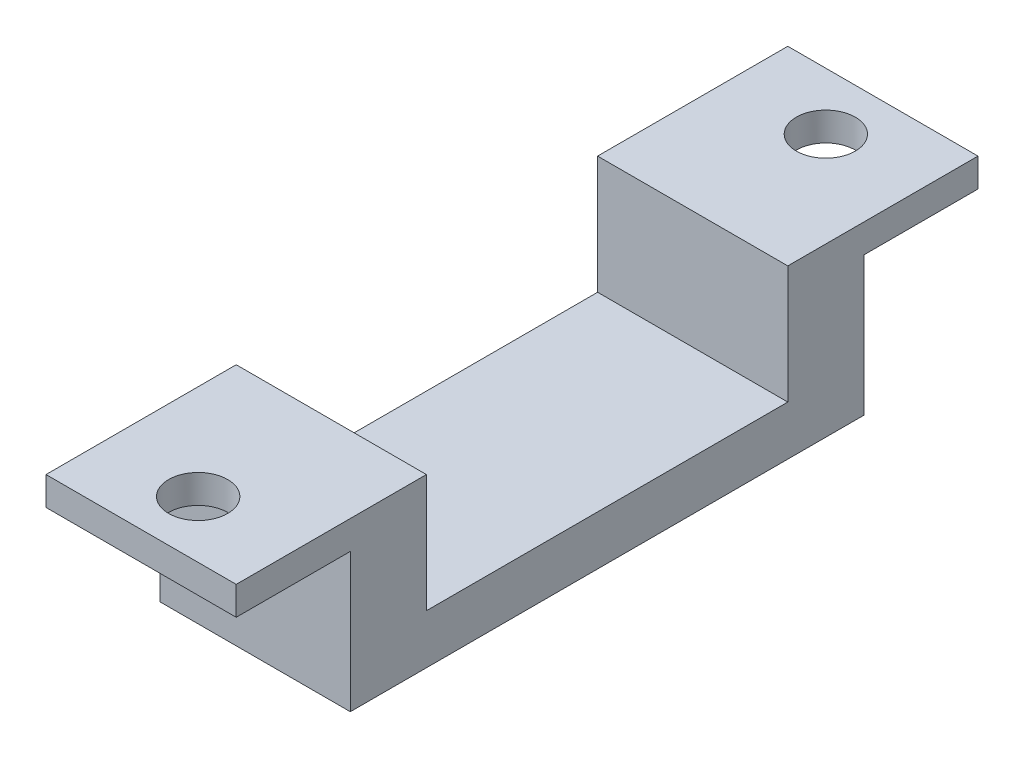
ISO-10303-21;
HEADER;
FILE_DESCRIPTION(('STEP AP214'),'2;1');
FILE_NAME('part.step','',(''),(''),'','','');
FILE_SCHEMA(('AUTOMOTIVE_DESIGN { 1 0 10303 214 1 1 1 1 }'));
ENDSEC;
DATA;
#1=APPLICATION_CONTEXT('core data for automotive mechanical design processes');
#2=APPLICATION_PROTOCOL_DEFINITION('international standard','automotive_design',2000,#1);
#3=PRODUCT_CONTEXT('',#1,'mechanical');
#4=PRODUCT('Part','Part','',(#3));
#5=PRODUCT_RELATED_PRODUCT_CATEGORY('part','',(#4));
#6=PRODUCT_DEFINITION_FORMATION('','',#4);
#7=PRODUCT_DEFINITION_CONTEXT('part definition',#1,'design');
#8=PRODUCT_DEFINITION('design','',#6,#7);
#9=PRODUCT_DEFINITION_SHAPE('','',#8);
#10=(LENGTH_UNIT() NAMED_UNIT(*) SI_UNIT(.MILLI.,.METRE.));
#11=(NAMED_UNIT(*) PLANE_ANGLE_UNIT() SI_UNIT($,.RADIAN.));
#12=(NAMED_UNIT(*) SI_UNIT($,.STERADIAN.) SOLID_ANGLE_UNIT());
#13=UNCERTAINTY_MEASURE_WITH_UNIT(LENGTH_MEASURE(1.E-05),#10,'distance_accuracy_value','');
#14=(GEOMETRIC_REPRESENTATION_CONTEXT(3) GLOBAL_UNCERTAINTY_ASSIGNED_CONTEXT((#13)) GLOBAL_UNIT_ASSIGNED_CONTEXT((#10,
#11,#12)) REPRESENTATION_CONTEXT('',''));
#15=CARTESIAN_POINT('',(0.,0.,0.));
#16=DIRECTION('',(0.,0.,1.));
#17=DIRECTION('',(1.,0.,0.));
#18=AXIS2_PLACEMENT_3D('',#15,#16,#17);
#19=CARTESIAN_POINT('',(-5.,2.6,-13.5));
#20=DIRECTION('',(0.,0.,1.));
#21=DIRECTION('',(1.,0.,0.));
#22=AXIS2_PLACEMENT_3D('',#19,#20,#21);
#23=PLANE('',#22);
#24=DIRECTION('',(-1.,0.,0.));
#25=VECTOR('',#24,1.);
#26=CARTESIAN_POINT('',(-5.,0.,-13.5));
#27=LINE('',#26,#25);
#28=CARTESIAN_POINT('',(5.,0.,-13.5));
#29=VERTEX_POINT('',#28);
#30=CARTESIAN_POINT('',(-5.,0.,-13.5));
#31=VERTEX_POINT('',#30);
#32=EDGE_CURVE('E220',#29,#31,#27,.T.);
#33=ORIENTED_EDGE('',*,*,#32,.T.);
#34=DIRECTION('',(0.,-1.,0.));
#35=VECTOR('',#34,1.);
#36=CARTESIAN_POINT('',(-5.,2.6,-13.5));
#37=LINE('',#36,#35);
#38=CARTESIAN_POINT('',(-5.,7.3,-13.5));
#39=VERTEX_POINT('',#38);
#40=EDGE_CURVE('E46',#39,#31,#37,.T.);
#41=ORIENTED_EDGE('',*,*,#40,.F.);
#42=DIRECTION('',(-1.,0.,0.));
#43=VECTOR('',#42,1.);
#44=CARTESIAN_POINT('',(5.,7.3,-13.5));
#45=LINE('',#44,#43);
#46=CARTESIAN_POINT('',(5.,7.3,-13.5));
#47=VERTEX_POINT('',#46);
#48=EDGE_CURVE('E177',#47,#39,#45,.T.);
#49=ORIENTED_EDGE('',*,*,#48,.F.);
#50=DIRECTION('',(0.,-1.,0.));
#51=VECTOR('',#50,1.);
#52=CARTESIAN_POINT('',(5.,2.6,-13.5));
#53=LINE('',#52,#51);
#54=EDGE_CURVE('E11',#47,#29,#53,.T.);
#55=ORIENTED_EDGE('',*,*,#54,.T.);
#56=EDGE_LOOP('',(#33,#41,#49,#55));
#57=FACE_BOUND('',#56,.T.);
#58=ADVANCED_FACE('F38',(#57),#23,.F.);
#59=CARTESIAN_POINT('',(0.,2.6,0.));
#60=DIRECTION('',(0.,-1.,0.));
#61=DIRECTION('',(0.,0.,-1.));
#62=AXIS2_PLACEMENT_3D('',#59,#60,#61);
#63=PLANE('',#62);
#64=DIRECTION('',(0.,0.,1.));
#65=VECTOR('',#64,1.);
#66=CARTESIAN_POINT('',(-5.,2.6,13.5));
#67=LINE('',#66,#65);
#68=CARTESIAN_POINT('',(-5.,2.6,-9.5));
#69=VERTEX_POINT('',#68);
#70=CARTESIAN_POINT('',(-5.,2.6,9.5));
#71=VERTEX_POINT('',#70);
#72=EDGE_CURVE('E214',#69,#71,#67,.T.);
#73=ORIENTED_EDGE('',*,*,#72,.T.);
#74=DIRECTION('',(1.,0.,0.));
#75=VECTOR('',#74,1.);
#76=CARTESIAN_POINT('',(-5.,2.6,9.5));
#77=LINE('',#76,#75);
#78=CARTESIAN_POINT('',(5.,2.6,9.5));
#79=VERTEX_POINT('',#78);
#80=EDGE_CURVE('E61',#71,#79,#77,.T.);
#81=ORIENTED_EDGE('',*,*,#80,.T.);
#82=DIRECTION('',(0.,0.,-1.));
#83=VECTOR('',#82,1.);
#84=CARTESIAN_POINT('',(5.,2.6,13.5));
#85=LINE('',#84,#83);
#86=CARTESIAN_POINT('',(5.,2.6,-9.5));
#87=VERTEX_POINT('',#86);
#88=EDGE_CURVE('E212',#79,#87,#85,.T.);
#89=ORIENTED_EDGE('',*,*,#88,.T.);
#90=DIRECTION('',(1.,0.,0.));
#91=VECTOR('',#90,1.);
#92=CARTESIAN_POINT('',(-5.,2.6,-9.5));
#93=LINE('',#92,#91);
#94=EDGE_CURVE('E196',#69,#87,#93,.T.);
#95=ORIENTED_EDGE('',*,*,#94,.F.);
#96=EDGE_LOOP('',(#73,#81,#89,#95));
#97=FACE_BOUND('',#96,.T.);
#98=ADVANCED_FACE('F251',(#97),#63,.F.);
#99=CARTESIAN_POINT('',(5.,2.6,13.5));
#100=DIRECTION('',(-1.,0.,0.));
#101=DIRECTION('',(0.,0.,1.));
#102=AXIS2_PLACEMENT_3D('',#99,#100,#101);
#103=PLANE('',#102);
#104=DIRECTION('',(0.,0.,-1.));
#105=VECTOR('',#104,1.);
#106=CARTESIAN_POINT('',(5.,0.,13.5));
#107=LINE('',#106,#105);
#108=CARTESIAN_POINT('',(5.,0.,13.5));
#109=VERTEX_POINT('',#108);
#110=EDGE_CURVE('E211',#109,#29,#107,.T.);
#111=ORIENTED_EDGE('',*,*,#110,.T.);
#112=ORIENTED_EDGE('',*,*,#54,.F.);
#113=DIRECTION('',(0.,0.,1.));
#114=VECTOR('',#113,1.);
#115=CARTESIAN_POINT('',(5.,7.3,-19.5));
#116=LINE('',#115,#114);
#117=CARTESIAN_POINT('',(5.,7.3,-19.5));
#118=VERTEX_POINT('',#117);
#119=EDGE_CURVE('E193',#118,#47,#116,.T.);
#120=ORIENTED_EDGE('',*,*,#119,.F.);
#121=DIRECTION('',(0.,-1.,0.));
#122=VECTOR('',#121,1.);
#123=CARTESIAN_POINT('',(5.,7.3,-19.5));
#124=LINE('',#123,#122);
#125=CARTESIAN_POINT('',(5.,8.8,-19.5));
#126=VERTEX_POINT('',#125);
#127=EDGE_CURVE('E184',#126,#118,#124,.T.);
#128=ORIENTED_EDGE('',*,*,#127,.F.);
#129=DIRECTION('',(0.,0.,-1.));
#130=VECTOR('',#129,1.);
#131=CARTESIAN_POINT('',(5.,8.8,-9.5));
#132=LINE('',#131,#130);
#133=CARTESIAN_POINT('',(5.,8.8,-9.5));
#134=VERTEX_POINT('',#133);
#135=EDGE_CURVE('E197',#134,#126,#132,.T.);
#136=ORIENTED_EDGE('',*,*,#135,.F.);
#137=DIRECTION('',(0.,-1.,0.));
#138=VECTOR('',#137,1.);
#139=CARTESIAN_POINT('',(5.,8.8,-9.5));
#140=LINE('',#139,#138);
#141=EDGE_CURVE('E203',#134,#87,#140,.T.);
#142=ORIENTED_EDGE('',*,*,#141,.T.);
#143=ORIENTED_EDGE('',*,*,#88,.F.);
#144=DIRECTION('',(0.,-1.,0.));
#145=VECTOR('',#144,1.);
#146=CARTESIAN_POINT('',(5.,8.8,9.5));
#147=LINE('',#146,#145);
#148=CARTESIAN_POINT('',(5.,8.8,9.5));
#149=VERTEX_POINT('',#148);
#150=EDGE_CURVE('E168',#149,#79,#147,.T.);
#151=ORIENTED_EDGE('',*,*,#150,.F.);
#152=DIRECTION('',(0.,0.,1.));
#153=VECTOR('',#152,1.);
#154=CARTESIAN_POINT('',(5.,8.8,9.5));
#155=LINE('',#154,#153);
#156=CARTESIAN_POINT('',(5.,8.8,19.5));
#157=VERTEX_POINT('',#156);
#158=EDGE_CURVE('E157',#149,#157,#155,.T.);
#159=ORIENTED_EDGE('',*,*,#158,.T.);
#160=DIRECTION('',(0.,-1.,0.));
#161=VECTOR('',#160,1.);
#162=CARTESIAN_POINT('',(5.,7.3,19.5));
#163=LINE('',#162,#161);
#164=CARTESIAN_POINT('',(5.,7.3,19.5));
#165=VERTEX_POINT('',#164);
#166=EDGE_CURVE('E148',#157,#165,#163,.T.);
#167=ORIENTED_EDGE('',*,*,#166,.T.);
#168=DIRECTION('',(0.,0.,-1.));
#169=VECTOR('',#168,1.);
#170=CARTESIAN_POINT('',(5.,7.3,19.5));
#171=LINE('',#170,#169);
#172=CARTESIAN_POINT('',(5.,7.3,13.5));
#173=VERTEX_POINT('',#172);
#174=EDGE_CURVE('E135',#165,#173,#171,.T.);
#175=ORIENTED_EDGE('',*,*,#174,.T.);
#176=DIRECTION('',(0.,-1.,0.));
#177=VECTOR('',#176,1.);
#178=CARTESIAN_POINT('',(5.,2.6,13.5));
#179=LINE('',#178,#177);
#180=EDGE_CURVE('E217',#173,#109,#179,.T.);
#181=ORIENTED_EDGE('',*,*,#180,.T.);
#182=EDGE_LOOP('',(#111,#112,#120,#128,#136,#142,#143,#151,#159,#167,#175,#181));
#183=FACE_BOUND('',#182,.T.);
#184=ADVANCED_FACE('F40',(#183),#103,.F.);
#185=CARTESIAN_POINT('',(-5.,2.6,13.5));
#186=DIRECTION('',(1.,0.,0.));
#187=DIRECTION('',(0.,0.,-1.));
#188=AXIS2_PLACEMENT_3D('',#185,#186,#187);
#189=PLANE('',#188);
#190=ORIENTED_EDGE('',*,*,#72,.F.);
#191=DIRECTION('',(0.,-1.,0.));
#192=VECTOR('',#191,1.);
#193=CARTESIAN_POINT('',(-5.,8.8,-9.5));
#194=LINE('',#193,#192);
#195=CARTESIAN_POINT('',(-5.,8.8,-9.5));
#196=VERTEX_POINT('',#195);
#197=EDGE_CURVE('E208',#196,#69,#194,.T.);
#198=ORIENTED_EDGE('',*,*,#197,.F.);
#199=DIRECTION('',(0.,0.,1.));
#200=VECTOR('',#199,1.);
#201=CARTESIAN_POINT('',(-5.,8.8,-9.5));
#202=LINE('',#201,#200);
#203=CARTESIAN_POINT('',(-5.,8.8,-19.5));
#204=VERTEX_POINT('',#203);
#205=EDGE_CURVE('E199',#204,#196,#202,.T.);
#206=ORIENTED_EDGE('',*,*,#205,.F.);
#207=DIRECTION('',(0.,1.,0.));
#208=VECTOR('',#207,1.);
#209=CARTESIAN_POINT('',(-5.,7.3,-19.5));
#210=LINE('',#209,#208);
#211=CARTESIAN_POINT('',(-5.,7.3,-19.5));
#212=VERTEX_POINT('',#211);
#213=EDGE_CURVE('E178',#212,#204,#210,.T.);
#214=ORIENTED_EDGE('',*,*,#213,.F.);
#215=DIRECTION('',(0.,0.,1.));
#216=VECTOR('',#215,1.);
#217=CARTESIAN_POINT('',(-5.,7.3,-19.5));
#218=LINE('',#217,#216);
#219=EDGE_CURVE('E188',#212,#39,#218,.T.);
#220=ORIENTED_EDGE('',*,*,#219,.T.);
#221=ORIENTED_EDGE('',*,*,#40,.T.);
#222=DIRECTION('',(0.,0.,1.));
#223=VECTOR('',#222,1.);
#224=CARTESIAN_POINT('',(-5.,0.,13.5));
#225=LINE('',#224,#223);
#226=CARTESIAN_POINT('',(-5.,0.,13.5));
#227=VERTEX_POINT('',#226);
#228=EDGE_CURVE('E223',#31,#227,#225,.T.);
#229=ORIENTED_EDGE('',*,*,#228,.T.);
#230=DIRECTION('',(0.,-1.,0.));
#231=VECTOR('',#230,1.);
#232=CARTESIAN_POINT('',(-5.,2.6,13.5));
#233=LINE('',#232,#231);
#234=CARTESIAN_POINT('',(-5.,7.3,13.5));
#235=VERTEX_POINT('',#234);
#236=EDGE_CURVE('E134',#235,#227,#233,.T.);
#237=ORIENTED_EDGE('',*,*,#236,.F.);
#238=DIRECTION('',(0.,0.,-1.));
#239=VECTOR('',#238,1.);
#240=CARTESIAN_POINT('',(-5.,7.3,19.5));
#241=LINE('',#240,#239);
#242=CARTESIAN_POINT('',(-5.,7.3,19.5));
#243=VERTEX_POINT('',#242);
#244=EDGE_CURVE('E53',#243,#235,#241,.T.);
#245=ORIENTED_EDGE('',*,*,#244,.F.);
#246=DIRECTION('',(0.,1.,0.));
#247=VECTOR('',#246,1.);
#248=CARTESIAN_POINT('',(-5.,7.3,19.5));
#249=LINE('',#248,#247);
#250=CARTESIAN_POINT('',(-5.,8.8,19.5));
#251=VERTEX_POINT('',#250);
#252=EDGE_CURVE('E131',#243,#251,#249,.T.);
#253=ORIENTED_EDGE('',*,*,#252,.T.);
#254=DIRECTION('',(0.,0.,-1.));
#255=VECTOR('',#254,1.);
#256=CARTESIAN_POINT('',(-5.,8.8,9.5));
#257=LINE('',#256,#255);
#258=CARTESIAN_POINT('',(-5.,8.8,9.5));
#259=VERTEX_POINT('',#258);
#260=EDGE_CURVE('E162',#251,#259,#257,.T.);
#261=ORIENTED_EDGE('',*,*,#260,.T.);
#262=DIRECTION('',(0.,-1.,0.));
#263=VECTOR('',#262,1.);
#264=CARTESIAN_POINT('',(-5.,8.8,9.5));
#265=LINE('',#264,#263);
#266=EDGE_CURVE('E164',#259,#71,#265,.T.);
#267=ORIENTED_EDGE('',*,*,#266,.T.);
#268=EDGE_LOOP('',(#190,#198,#206,#214,#220,#221,#229,#237,#245,#253,#261,#267));
#269=FACE_BOUND('',#268,.T.);
#270=ADVANCED_FACE('F129',(#269),#189,.F.);
#271=CARTESIAN_POINT('',(-5.,2.6,13.5));
#272=DIRECTION('',(0.,0.,-1.));
#273=DIRECTION('',(-1.,0.,0.));
#274=AXIS2_PLACEMENT_3D('',#271,#272,#273);
#275=PLANE('',#274);
#276=ORIENTED_EDGE('',*,*,#180,.F.);
#277=DIRECTION('',(-1.,0.,0.));
#278=VECTOR('',#277,1.);
#279=CARTESIAN_POINT('',(5.,7.3,13.5));
#280=LINE('',#279,#278);
#281=EDGE_CURVE('E145',#173,#235,#280,.T.);
#282=ORIENTED_EDGE('',*,*,#281,.T.);
#283=ORIENTED_EDGE('',*,*,#236,.T.);
#284=DIRECTION('',(1.,0.,0.));
#285=VECTOR('',#284,1.);
#286=CARTESIAN_POINT('',(-5.,0.,13.5));
#287=LINE('',#286,#285);
#288=EDGE_CURVE('E215',#227,#109,#287,.T.);
#289=ORIENTED_EDGE('',*,*,#288,.T.);
#290=EDGE_LOOP('',(#276,#282,#283,#289));
#291=FACE_BOUND('',#290,.T.);
#292=ADVANCED_FACE('F240',(#291),#275,.F.);
#293=CARTESIAN_POINT('',(0.,0.,0.));
#294=DIRECTION('',(0.,-1.,0.));
#295=DIRECTION('',(0.,0.,-1.));
#296=AXIS2_PLACEMENT_3D('',#293,#294,#295);
#297=PLANE('',#296);
#298=ORIENTED_EDGE('',*,*,#110,.F.);
#299=ORIENTED_EDGE('',*,*,#288,.F.);
#300=ORIENTED_EDGE('',*,*,#228,.F.);
#301=ORIENTED_EDGE('',*,*,#32,.F.);
#302=EDGE_LOOP('',(#298,#299,#300,#301));
#303=FACE_BOUND('',#302,.T.);
#304=ADVANCED_FACE('F237',(#303),#297,.T.);
#305=CARTESIAN_POINT('',(-5.,8.8,-9.5));
#306=DIRECTION('',(0.,0.,-1.));
#307=DIRECTION('',(-1.,0.,0.));
#308=AXIS2_PLACEMENT_3D('',#305,#306,#307);
#309=PLANE('',#308);
#310=ORIENTED_EDGE('',*,*,#94,.T.);
#311=ORIENTED_EDGE('',*,*,#141,.F.);
#312=DIRECTION('',(1.,0.,0.));
#313=VECTOR('',#312,1.);
#314=CARTESIAN_POINT('',(-5.,8.8,-9.5));
#315=LINE('',#314,#313);
#316=EDGE_CURVE('E201',#196,#134,#315,.T.);
#317=ORIENTED_EDGE('',*,*,#316,.F.);
#318=ORIENTED_EDGE('',*,*,#197,.T.);
#319=EDGE_LOOP('',(#310,#311,#317,#318));
#320=FACE_BOUND('',#319,.T.);
#321=ADVANCED_FACE('F253',(#320),#309,.F.);
#322=CARTESIAN_POINT('',(0.,8.8,0.));
#323=DIRECTION('',(0.,-1.,0.));
#324=DIRECTION('',(0.,0.,-1.));
#325=AXIS2_PLACEMENT_3D('',#322,#323,#324);
#326=PLANE('',#325);
#327=CARTESIAN_POINT('',(0.,8.8,-16.5));
#328=DIRECTION('',(0.,-1.,0.));
#329=DIRECTION('',(0.,0.,-1.));
#330=AXIS2_PLACEMENT_3D('',#327,#328,#329);
#331=CIRCLE('',#330,1.55);
#332=CARTESIAN_POINT('',(0.,8.8,-18.05));
#333=VERTEX_POINT('',#332);
#334=EDGE_CURVE('E174',#333,#333,#331,.T.);
#335=ORIENTED_EDGE('',*,*,#334,.T.);
#336=EDGE_LOOP('',(#335));
#337=FACE_BOUND('',#336,.T.);
#338=ORIENTED_EDGE('',*,*,#135,.T.);
#339=DIRECTION('',(1.,0.,0.));
#340=VECTOR('',#339,1.);
#341=CARTESIAN_POINT('',(5.,8.8,-19.5));
#342=LINE('',#341,#340);
#343=EDGE_CURVE('E181',#204,#126,#342,.T.);
#344=ORIENTED_EDGE('',*,*,#343,.F.);
#345=ORIENTED_EDGE('',*,*,#205,.T.);
#346=ORIENTED_EDGE('',*,*,#316,.T.);
#347=EDGE_LOOP('',(#338,#344,#345,#346));
#348=FACE_BOUND('',#347,.T.);
#349=ADVANCED_FACE('F257',(#337,#348),#326,.F.);
#350=CARTESIAN_POINT('',(5.,7.3,-19.5));
#351=DIRECTION('',(0.,1.,0.));
#352=DIRECTION('',(0.,0.,1.));
#353=AXIS2_PLACEMENT_3D('',#350,#351,#352);
#354=PLANE('',#353);
#355=CARTESIAN_POINT('',(0.,7.3,-16.5));
#356=DIRECTION('',(0.,-1.,0.));
#357=DIRECTION('',(1.,0.,0.));
#358=AXIS2_PLACEMENT_3D('',#355,#356,#357);
#359=CIRCLE('',#358,1.55);
#360=CARTESIAN_POINT('',(1.55,7.3,-16.5));
#361=VERTEX_POINT('',#360);
#362=EDGE_CURVE('E171',#361,#361,#359,.T.);
#363=ORIENTED_EDGE('',*,*,#362,.F.);
#364=EDGE_LOOP('',(#363));
#365=FACE_BOUND('',#364,.T.);
#366=ORIENTED_EDGE('',*,*,#48,.T.);
#367=ORIENTED_EDGE('',*,*,#219,.F.);
#368=DIRECTION('',(-1.,0.,0.));
#369=VECTOR('',#368,1.);
#370=CARTESIAN_POINT('',(5.,7.3,-19.5));
#371=LINE('',#370,#369);
#372=EDGE_CURVE('E186',#118,#212,#371,.T.);
#373=ORIENTED_EDGE('',*,*,#372,.F.);
#374=ORIENTED_EDGE('',*,*,#119,.T.);
#375=EDGE_LOOP('',(#366,#367,#373,#374));
#376=FACE_BOUND('',#375,.T.);
#377=ADVANCED_FACE('F264',(#365,#376),#354,.F.);
#378=CARTESIAN_POINT('',(0.,0.,-19.5));
#379=DIRECTION('',(0.,0.,1.));
#380=DIRECTION('',(1.,0.,0.));
#381=AXIS2_PLACEMENT_3D('',#378,#379,#380);
#382=PLANE('',#381);
#383=ORIENTED_EDGE('',*,*,#213,.T.);
#384=ORIENTED_EDGE('',*,*,#343,.T.);
#385=ORIENTED_EDGE('',*,*,#127,.T.);
#386=ORIENTED_EDGE('',*,*,#372,.T.);
#387=EDGE_LOOP('',(#383,#384,#385,#386));
#388=FACE_BOUND('',#387,.T.);
#389=ADVANCED_FACE('F260',(#388),#382,.F.);
#390=CARTESIAN_POINT('',(0.,12.3,-16.5));
#391=DIRECTION('',(0.,-1.,0.));
#392=DIRECTION('',(1.,0.,0.));
#393=AXIS2_PLACEMENT_3D('',#390,#391,#392);
#394=CYLINDRICAL_SURFACE('',#393,1.55);
#395=ORIENTED_EDGE('',*,*,#362,.T.);
#396=EDGE_LOOP('',(#395));
#397=FACE_BOUND('',#396,.T.);
#398=ORIENTED_EDGE('',*,*,#334,.F.);
#399=EDGE_LOOP('',(#398));
#400=FACE_BOUND('',#399,.T.);
#401=ADVANCED_FACE('F272',(#397,#400),#394,.F.);
#402=CARTESIAN_POINT('',(-5.,8.8,9.5));
#403=DIRECTION('',(0.,0.,-1.));
#404=DIRECTION('',(-1.,0.,0.));
#405=AXIS2_PLACEMENT_3D('',#402,#403,#404);
#406=PLANE('',#405);
#407=ORIENTED_EDGE('',*,*,#80,.F.);
#408=ORIENTED_EDGE('',*,*,#266,.F.);
#409=DIRECTION('',(1.,0.,0.));
#410=VECTOR('',#409,1.);
#411=CARTESIAN_POINT('',(-5.,8.8,9.5));
#412=LINE('',#411,#410);
#413=EDGE_CURVE('E159',#259,#149,#412,.T.);
#414=ORIENTED_EDGE('',*,*,#413,.T.);
#415=ORIENTED_EDGE('',*,*,#150,.T.);
#416=EDGE_LOOP('',(#407,#408,#414,#415));
#417=FACE_BOUND('',#416,.T.);
#418=ADVANCED_FACE('F248',(#417),#406,.T.);
#419=CARTESIAN_POINT('',(0.,8.8,0.));
#420=DIRECTION('',(0.,-1.,0.));
#421=DIRECTION('',(0.,0.,1.));
#422=AXIS2_PLACEMENT_3D('',#419,#420,#421);
#423=PLANE('',#422);
#424=CARTESIAN_POINT('',(0.,8.8,16.5));
#425=DIRECTION('',(0.,-1.,0.));
#426=DIRECTION('',(0.,0.,-1.));
#427=AXIS2_PLACEMENT_3D('',#424,#425,#426);
#428=CIRCLE('',#427,1.55);
#429=CARTESIAN_POINT('',(0.,8.8,14.95));
#430=VERTEX_POINT('',#429);
#431=EDGE_CURVE('E155',#430,#430,#428,.F.);
#432=ORIENTED_EDGE('',*,*,#431,.F.);
#433=EDGE_LOOP('',(#432));
#434=FACE_BOUND('',#433,.T.);
#435=ORIENTED_EDGE('',*,*,#158,.F.);
#436=ORIENTED_EDGE('',*,*,#413,.F.);
#437=ORIENTED_EDGE('',*,*,#260,.F.);
#438=DIRECTION('',(1.,0.,0.));
#439=VECTOR('',#438,1.);
#440=CARTESIAN_POINT('',(5.,8.8,19.5));
#441=LINE('',#440,#439);
#442=EDGE_CURVE('E144',#251,#157,#441,.T.);
#443=ORIENTED_EDGE('',*,*,#442,.T.);
#444=EDGE_LOOP('',(#435,#436,#437,#443));
#445=FACE_BOUND('',#444,.T.);
#446=ADVANCED_FACE('F244',(#434,#445),#423,.F.);
#447=CARTESIAN_POINT('',(5.,7.3,19.5));
#448=DIRECTION('',(0.,-1.,0.));
#449=DIRECTION('',(0.,0.,-1.));
#450=AXIS2_PLACEMENT_3D('',#447,#448,#449);
#451=PLANE('',#450);
#452=CARTESIAN_POINT('',(0.,7.3,16.5));
#453=DIRECTION('',(0.,1.,0.));
#454=DIRECTION('',(1.,0.,0.));
#455=AXIS2_PLACEMENT_3D('',#452,#453,#454);
#456=CIRCLE('',#455,1.55);
#457=CARTESIAN_POINT('',(1.55,7.3,16.5));
#458=VERTEX_POINT('',#457);
#459=EDGE_CURVE('E423',#458,#458,#456,.T.);
#460=ORIENTED_EDGE('',*,*,#459,.T.);
#461=EDGE_LOOP('',(#460));
#462=FACE_BOUND('',#461,.T.);
#463=ORIENTED_EDGE('',*,*,#281,.F.);
#464=ORIENTED_EDGE('',*,*,#174,.F.);
#465=DIRECTION('',(-1.,0.,0.));
#466=VECTOR('',#465,1.);
#467=CARTESIAN_POINT('',(5.,7.3,19.5));
#468=LINE('',#467,#466);
#469=EDGE_CURVE('E141',#165,#243,#468,.T.);
#470=ORIENTED_EDGE('',*,*,#469,.T.);
#471=ORIENTED_EDGE('',*,*,#244,.T.);
#472=EDGE_LOOP('',(#463,#464,#470,#471));
#473=FACE_BOUND('',#472,.T.);
#474=ADVANCED_FACE('F147',(#462,#473),#451,.T.);
#475=CARTESIAN_POINT('',(0.,0.,19.5));
#476=DIRECTION('',(0.,0.,-1.));
#477=DIRECTION('',(1.,0.,0.));
#478=AXIS2_PLACEMENT_3D('',#475,#476,#477);
#479=PLANE('',#478);
#480=ORIENTED_EDGE('',*,*,#252,.F.);
#481=ORIENTED_EDGE('',*,*,#469,.F.);
#482=ORIENTED_EDGE('',*,*,#166,.F.);
#483=ORIENTED_EDGE('',*,*,#442,.F.);
#484=EDGE_LOOP('',(#480,#481,#482,#483));
#485=FACE_BOUND('',#484,.T.);
#486=ADVANCED_FACE('F139',(#485),#479,.F.);
#487=CARTESIAN_POINT('',(0.,12.3,16.5));
#488=DIRECTION('',(0.,-1.,0.));
#489=DIRECTION('',(1.,0.,0.));
#490=AXIS2_PLACEMENT_3D('',#487,#488,#489);
#491=CYLINDRICAL_SURFACE('',#490,1.55);
#492=ORIENTED_EDGE('',*,*,#459,.F.);
#493=EDGE_LOOP('',(#492));
#494=FACE_BOUND('',#493,.T.);
#495=ORIENTED_EDGE('',*,*,#431,.T.);
#496=EDGE_LOOP('',(#495));
#497=FACE_BOUND('',#496,.T.);
#498=ADVANCED_FACE('F391',(#494,#497),#491,.F.);
#499=CLOSED_SHELL('',(#58,#98,#184,#270,#292,#304,#321,#349,#377,#389,#401,#418,#446,#474,#486,#498));
#500=MANIFOLD_SOLID_BREP('B2',#499);
#501=ADVANCED_BREP_SHAPE_REPRESENTATION('',(#18,#500),#14);
#502=SHAPE_DEFINITION_REPRESENTATION(#9,#501);
ENDSEC;
END-ISO-10303-21;
